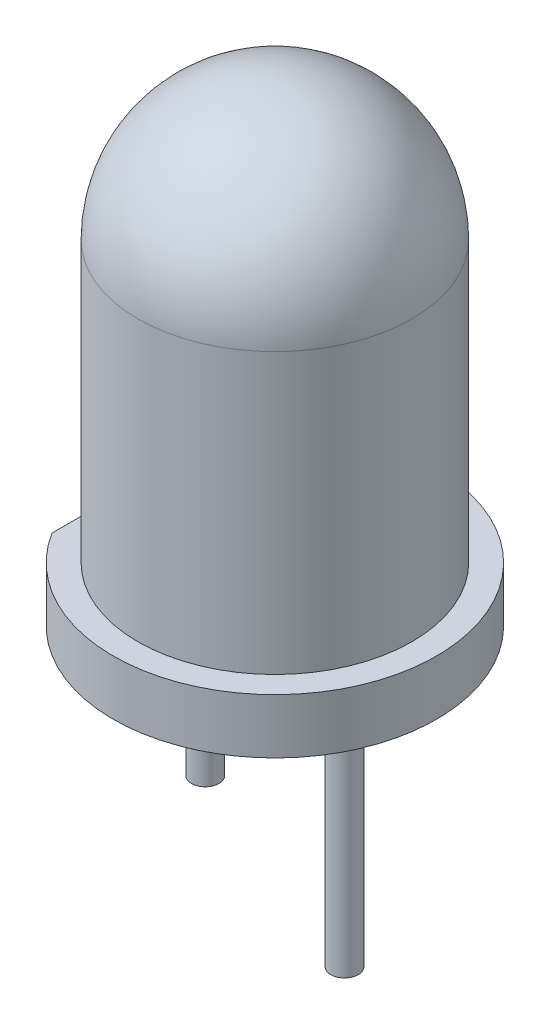
ISO-10303-21;
HEADER;
FILE_DESCRIPTION(('STEP AP214'),'2;1');
FILE_NAME('part.step','',(''),(''),'','','');
FILE_SCHEMA(('AUTOMOTIVE_DESIGN { 1 0 10303 214 1 1 1 1 }'));
ENDSEC;
DATA;
#1=APPLICATION_CONTEXT('core data for automotive mechanical design processes');
#2=APPLICATION_PROTOCOL_DEFINITION('international standard','automotive_design',2000,#1);
#3=PRODUCT_CONTEXT('',#1,'mechanical');
#4=PRODUCT('Part','Part','',(#3));
#5=PRODUCT_RELATED_PRODUCT_CATEGORY('part','',(#4));
#6=PRODUCT_DEFINITION_FORMATION('','',#4);
#7=PRODUCT_DEFINITION_CONTEXT('part definition',#1,'design');
#8=PRODUCT_DEFINITION('design','',#6,#7);
#9=PRODUCT_DEFINITION_SHAPE('','',#8);
#10=(LENGTH_UNIT() NAMED_UNIT(*) SI_UNIT(.MILLI.,.METRE.));
#11=(NAMED_UNIT(*) PLANE_ANGLE_UNIT() SI_UNIT($,.RADIAN.));
#12=(NAMED_UNIT(*) SI_UNIT($,.STERADIAN.) SOLID_ANGLE_UNIT());
#13=UNCERTAINTY_MEASURE_WITH_UNIT(LENGTH_MEASURE(1.E-05),#10,'distance_accuracy_value','');
#14=(GEOMETRIC_REPRESENTATION_CONTEXT(3) GLOBAL_UNCERTAINTY_ASSIGNED_CONTEXT((#13)) GLOBAL_UNIT_ASSIGNED_CONTEXT((#10,
#11,#12)) REPRESENTATION_CONTEXT('',''));
#15=CARTESIAN_POINT('',(0.,0.,0.));
#16=DIRECTION('',(0.,0.,1.));
#17=DIRECTION('',(1.,0.,0.));
#18=AXIS2_PLACEMENT_3D('',#15,#16,#17);
#19=CARTESIAN_POINT('',(-1.27,-4.75,0.));
#20=DIRECTION('',(0.,1.,0.));
#21=DIRECTION('',(0.,0.,1.));
#22=AXIS2_PLACEMENT_3D('',#19,#20,#21);
#23=CYLINDRICAL_SURFACE('',#22,0.25);
#24=CARTESIAN_POINT('',(-1.27,0.,0.));
#25=DIRECTION('',(0.,1.,0.));
#26=DIRECTION('',(0.,0.,1.));
#27=AXIS2_PLACEMENT_3D('',#24,#25,#26);
#28=CIRCLE('',#27,0.25);
#29=CARTESIAN_POINT('',(-1.27,0.,0.25));
#30=VERTEX_POINT('',#29);
#31=EDGE_CURVE('E85',#30,#30,#28,.F.);
#32=ORIENTED_EDGE('',*,*,#31,.T.);
#33=EDGE_LOOP('',(#32));
#34=FACE_BOUND('',#33,.T.);
#35=CARTESIAN_POINT('',(-1.27,-3.,0.));
#36=DIRECTION('',(0.,-1.,0.));
#37=DIRECTION('',(0.,0.,-1.));
#38=AXIS2_PLACEMENT_3D('',#35,#36,#37);
#39=CIRCLE('',#38,0.25);
#40=CARTESIAN_POINT('',(-1.27,-3.,-0.25));
#41=VERTEX_POINT('',#40);
#42=EDGE_CURVE('E69',#41,#41,#39,.T.);
#43=ORIENTED_EDGE('',*,*,#42,.F.);
#44=EDGE_LOOP('',(#43));
#45=FACE_BOUND('',#44,.T.);
#46=ADVANCED_FACE('F35',(#34,#45),#23,.T.);
#47=CARTESIAN_POINT('',(0.,1.,0.));
#48=DIRECTION('',(0.,-1.,0.));
#49=DIRECTION('',(0.,0.,-1.));
#50=AXIS2_PLACEMENT_3D('',#47,#48,#49);
#51=CYLINDRICAL_SURFACE('',#50,2.95);
#52=CARTESIAN_POINT('',(0.,1.,0.));
#53=DIRECTION('',(0.,1.,0.));
#54=DIRECTION('',(0.,0.,1.));
#55=AXIS2_PLACEMENT_3D('',#52,#53,#54);
#56=CIRCLE('',#55,2.95);
#57=CARTESIAN_POINT('',(-2.5,1.,1.56604597633659));
#58=VERTEX_POINT('',#57);
#59=CARTESIAN_POINT('',(-2.5,1.,-1.56604597633659));
#60=VERTEX_POINT('',#59);
#61=EDGE_CURVE('E75',#58,#60,#56,.T.);
#62=ORIENTED_EDGE('',*,*,#61,.F.);
#63=DIRECTION('',(0.,-1.,0.));
#64=VECTOR('',#63,1.);
#65=CARTESIAN_POINT('',(-2.5,1.,1.56604597633659));
#66=LINE('',#65,#64);
#67=CARTESIAN_POINT('',(-2.5,0.,1.56604597633659));
#68=VERTEX_POINT('',#67);
#69=EDGE_CURVE('E60',#58,#68,#66,.T.);
#70=ORIENTED_EDGE('',*,*,#69,.T.);
#71=CARTESIAN_POINT('',(0.,0.,0.));
#72=DIRECTION('',(0.,1.,0.));
#73=DIRECTION('',(0.,0.,1.));
#74=AXIS2_PLACEMENT_3D('',#71,#72,#73);
#75=CIRCLE('',#74,2.95);
#76=CARTESIAN_POINT('',(-2.5,0.,-1.56604597633659));
#77=VERTEX_POINT('',#76);
#78=EDGE_CURVE('E82',#68,#77,#75,.T.);
#79=ORIENTED_EDGE('',*,*,#78,.T.);
#80=DIRECTION('',(0.,-1.,0.));
#81=VECTOR('',#80,1.);
#82=CARTESIAN_POINT('',(-2.5,1.,-1.56604597633659));
#83=LINE('',#82,#81);
#84=EDGE_CURVE('E50',#77,#60,#83,.F.);
#85=ORIENTED_EDGE('',*,*,#84,.T.);
#86=EDGE_LOOP('',(#62,#70,#79,#85));
#87=FACE_BOUND('',#86,.T.);
#88=ADVANCED_FACE('F80',(#87),#51,.T.);
#89=CARTESIAN_POINT('',(0.,1.,0.));
#90=DIRECTION('',(0.,1.,0.));
#91=DIRECTION('',(0.,0.,1.));
#92=AXIS2_PLACEMENT_3D('',#89,#90,#91);
#93=PLANE('',#92);
#94=DIRECTION('',(0.,0.,-1.));
#95=VECTOR('',#94,1.);
#96=CARTESIAN_POINT('',(-2.5,1.,0.));
#97=LINE('',#96,#95);
#98=CARTESIAN_POINT('',(-2.5,1.,0.));
#99=VERTEX_POINT('',#98);
#100=EDGE_CURVE('E63',#58,#99,#97,.T.);
#101=ORIENTED_EDGE('',*,*,#100,.F.);
#102=ORIENTED_EDGE('',*,*,#61,.T.);
#103=EDGE_CURVE('E78',#99,#60,#97,.T.);
#104=ORIENTED_EDGE('',*,*,#103,.F.);
#105=CARTESIAN_POINT('',(0.,1.,0.));
#106=DIRECTION('',(0.,1.,0.));
#107=DIRECTION('',(0.,0.,1.));
#108=AXIS2_PLACEMENT_3D('',#105,#106,#107);
#109=CIRCLE('',#108,2.5);
#110=EDGE_CURVE('E77',#99,#99,#109,.T.);
#111=ORIENTED_EDGE('',*,*,#110,.F.);
#112=EDGE_LOOP('',(#101,#102,#104,#111));
#113=FACE_BOUND('',#112,.T.);
#114=ADVANCED_FACE('F74',(#113),#93,.T.);
#115=CARTESIAN_POINT('',(0.,0.,0.));
#116=DIRECTION('',(0.,1.,0.));
#117=DIRECTION('',(0.,0.,1.));
#118=AXIS2_PLACEMENT_3D('',#115,#116,#117);
#119=PLANE('',#118);
#120=CARTESIAN_POINT('',(1.27,0.,0.));
#121=DIRECTION('',(0.,1.,0.));
#122=DIRECTION('',(0.,0.,1.));
#123=AXIS2_PLACEMENT_3D('',#120,#121,#122);
#124=CIRCLE('',#123,0.25);
#125=CARTESIAN_POINT('',(1.27,0.,0.25));
#126=VERTEX_POINT('',#125);
#127=EDGE_CURVE('E43',#126,#126,#124,.F.);
#128=ORIENTED_EDGE('',*,*,#127,.F.);
#129=EDGE_LOOP('',(#128));
#130=FACE_BOUND('',#129,.T.);
#131=ORIENTED_EDGE('',*,*,#31,.F.);
#132=EDGE_LOOP('',(#131));
#133=FACE_BOUND('',#132,.T.);
#134=ORIENTED_EDGE('',*,*,#78,.F.);
#135=DIRECTION('',(0.,0.,-1.));
#136=VECTOR('',#135,1.);
#137=CARTESIAN_POINT('',(-2.5,0.,0.));
#138=LINE('',#137,#136);
#139=EDGE_CURVE('E11',#68,#77,#138,.T.);
#140=ORIENTED_EDGE('',*,*,#139,.T.);
#141=EDGE_LOOP('',(#134,#140));
#142=FACE_BOUND('',#141,.T.);
#143=ADVANCED_FACE('F97',(#130,#133,#142),#119,.F.);
#144=CARTESIAN_POINT('',(0.,8.6,0.));
#145=DIRECTION('',(0.,-1.,0.));
#146=DIRECTION('',(0.,0.,-1.));
#147=AXIS2_PLACEMENT_3D('',#144,#145,#146);
#148=CYLINDRICAL_SURFACE('',#147,2.5);
#149=CARTESIAN_POINT('',(0.,6.1,0.));
#150=DIRECTION('',(0.,-1.,0.));
#151=DIRECTION('',(0.,0.,-1.));
#152=AXIS2_PLACEMENT_3D('',#149,#150,#151);
#153=CIRCLE('',#152,2.5);
#154=CARTESIAN_POINT('',(0.,6.1,-2.5));
#155=VERTEX_POINT('',#154);
#156=EDGE_CURVE('E81',#155,#155,#153,.T.);
#157=ORIENTED_EDGE('',*,*,#156,.T.);
#158=EDGE_LOOP('',(#157));
#159=FACE_BOUND('',#158,.T.);
#160=ORIENTED_EDGE('',*,*,#110,.T.);
#161=EDGE_LOOP('',(#160));
#162=FACE_BOUND('',#161,.T.);
#163=ADVANCED_FACE('F100',(#159,#162),#148,.T.);
#164=CARTESIAN_POINT('',(0.,6.1,0.));
#165=DIRECTION('',(0.,1.,0.));
#166=DIRECTION('',(0.,0.,1.));
#167=AXIS2_PLACEMENT_3D('',#164,#165,#166);
#168=SPHERICAL_SURFACE('',#167,2.5);
#169=ORIENTED_EDGE('',*,*,#156,.F.);
#170=EDGE_LOOP('',(#169));
#171=FACE_BOUND('',#170,.T.);
#172=ADVANCED_FACE('F37',(#171),#168,.T.);
#173=CARTESIAN_POINT('',(1.27,-4.75,0.));
#174=DIRECTION('',(0.,1.,0.));
#175=DIRECTION('',(0.,0.,1.));
#176=AXIS2_PLACEMENT_3D('',#173,#174,#175);
#177=CYLINDRICAL_SURFACE('',#176,0.25);
#178=CARTESIAN_POINT('',(1.27,-4.75,0.));
#179=DIRECTION('',(0.,-1.,0.));
#180=DIRECTION('',(0.,0.,-1.));
#181=AXIS2_PLACEMENT_3D('',#178,#179,#180);
#182=CIRCLE('',#181,0.25);
#183=CARTESIAN_POINT('',(1.27,-4.75,-0.25));
#184=VERTEX_POINT('',#183);
#185=EDGE_CURVE('E111',#184,#184,#182,.T.);
#186=ORIENTED_EDGE('',*,*,#185,.F.);
#187=EDGE_LOOP('',(#186));
#188=FACE_BOUND('',#187,.T.);
#189=ORIENTED_EDGE('',*,*,#127,.T.);
#190=EDGE_LOOP('',(#189));
#191=FACE_BOUND('',#190,.T.);
#192=ADVANCED_FACE('F95',(#188,#191),#177,.T.);
#193=CARTESIAN_POINT('',(1.27,-4.75,0.));
#194=DIRECTION('',(0.,-1.,0.));
#195=DIRECTION('',(0.,0.,-1.));
#196=AXIS2_PLACEMENT_3D('',#193,#194,#195);
#197=PLANE('',#196);
#198=ORIENTED_EDGE('',*,*,#185,.T.);
#199=EDGE_LOOP('',(#198));
#200=FACE_BOUND('',#199,.T.);
#201=ADVANCED_FACE('F162',(#200),#197,.T.);
#202=CARTESIAN_POINT('',(-1.27,-3.,0.));
#203=DIRECTION('',(0.,-1.,0.));
#204=DIRECTION('',(0.,0.,-1.));
#205=AXIS2_PLACEMENT_3D('',#202,#203,#204);
#206=PLANE('',#205);
#207=ORIENTED_EDGE('',*,*,#42,.T.);
#208=EDGE_LOOP('',(#207));
#209=FACE_BOUND('',#208,.T.);
#210=ADVANCED_FACE('F153',(#209),#206,.T.);
#211=CARTESIAN_POINT('',(-2.5,-4.75,0.));
#212=DIRECTION('',(1.,0.,0.));
#213=DIRECTION('',(0.,0.,-1.));
#214=AXIS2_PLACEMENT_3D('',#211,#212,#213);
#215=PLANE('',#214);
#216=ORIENTED_EDGE('',*,*,#100,.T.);
#217=ORIENTED_EDGE('',*,*,#103,.T.);
#218=ORIENTED_EDGE('',*,*,#84,.F.);
#219=ORIENTED_EDGE('',*,*,#139,.F.);
#220=ORIENTED_EDGE('',*,*,#69,.F.);
#221=EDGE_LOOP('',(#216,#217,#218,#219,#220));
#222=FACE_BOUND('',#221,.T.);
#223=ADVANCED_FACE('F62',(#222),#215,.F.);
#224=CLOSED_SHELL('',(#46,#88,#114,#143,#163,#172,#192,#201,#210,#223));
#225=MANIFOLD_SOLID_BREP('B2',#224);
#226=ADVANCED_BREP_SHAPE_REPRESENTATION('',(#18,#225),#14);
#227=SHAPE_DEFINITION_REPRESENTATION(#9,#226);
ENDSEC;
END-ISO-10303-21;
